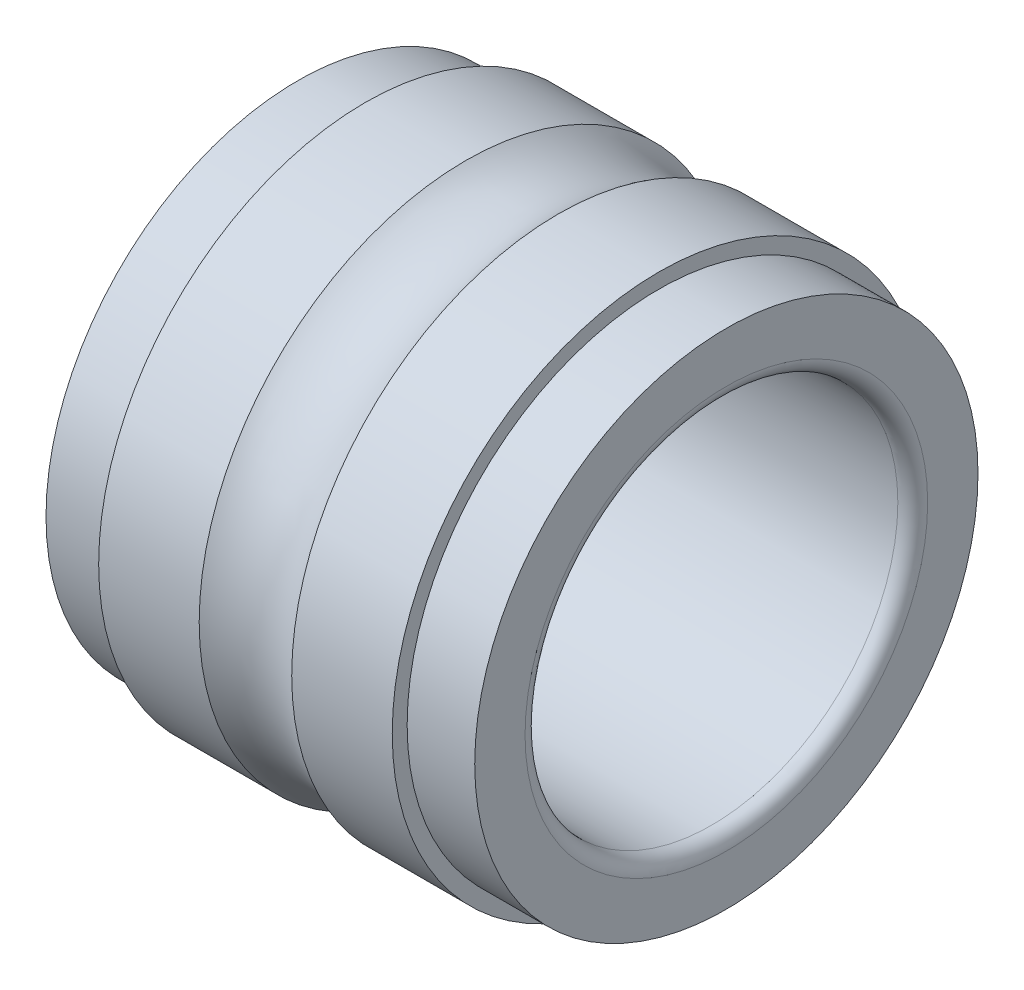
ISO-10303-21;
HEADER;
FILE_DESCRIPTION(('STEP AP214'),'2;1');
FILE_NAME('part.step','',(''),(''),'','','');
FILE_SCHEMA(('AUTOMOTIVE_DESIGN { 1 0 10303 214 1 1 1 1 }'));
ENDSEC;
DATA;
#1=APPLICATION_CONTEXT('core data for automotive mechanical design processes');
#2=APPLICATION_PROTOCOL_DEFINITION('international standard','automotive_design',2000,#1);
#3=PRODUCT_CONTEXT('',#1,'mechanical');
#4=PRODUCT('Part','Part','',(#3));
#5=PRODUCT_RELATED_PRODUCT_CATEGORY('part','',(#4));
#6=PRODUCT_DEFINITION_FORMATION('','',#4);
#7=PRODUCT_DEFINITION_CONTEXT('part definition',#1,'design');
#8=PRODUCT_DEFINITION('design','',#6,#7);
#9=PRODUCT_DEFINITION_SHAPE('','',#8);
#10=(LENGTH_UNIT() NAMED_UNIT(*) SI_UNIT(.MILLI.,.METRE.));
#11=(NAMED_UNIT(*) PLANE_ANGLE_UNIT() SI_UNIT($,.RADIAN.));
#12=(NAMED_UNIT(*) SI_UNIT($,.STERADIAN.) SOLID_ANGLE_UNIT());
#13=UNCERTAINTY_MEASURE_WITH_UNIT(LENGTH_MEASURE(1.E-05),#10,'distance_accuracy_value','');
#14=(GEOMETRIC_REPRESENTATION_CONTEXT(3) GLOBAL_UNCERTAINTY_ASSIGNED_CONTEXT((#13)) GLOBAL_UNIT_ASSIGNED_CONTEXT((#10,
#11,#12)) REPRESENTATION_CONTEXT('',''));
#15=CARTESIAN_POINT('',(0.,0.,0.));
#16=DIRECTION('',(0.,0.,1.));
#17=DIRECTION('',(1.,0.,0.));
#18=AXIS2_PLACEMENT_3D('',#15,#16,#17);
#19=CARTESIAN_POINT('',(-2.65,0.,0.));
#20=DIRECTION('',(1.,0.,0.));
#21=DIRECTION('',(0.,0.,1.));
#22=AXIS2_PLACEMENT_3D('',#19,#20,#21);
#23=TOROIDAL_SURFACE('',#22,1.775,0.425);
#24=CARTESIAN_POINT('',(-2.4018065271,0.,0.));
#25=DIRECTION('',(1.,0.,0.));
#26=DIRECTION('',(0.,0.,-1.));
#27=AXIS2_PLACEMENT_3D('',#24,#25,#26);
#28=CIRCLE('',#27,1.43);
#29=CARTESIAN_POINT('',(-2.4018065271,0.,-1.43));
#30=VERTEX_POINT('',#29);
#31=EDGE_CURVE('E166',#30,#30,#28,.T.);
#32=ORIENTED_EDGE('',*,*,#31,.F.);
#33=EDGE_LOOP('',(#32));
#34=FACE_BOUND('',#33,.T.);
#35=CARTESIAN_POINT('',(-2.89819347292004,0.,0.));
#36=DIRECTION('',(1.,0.,0.));
#37=DIRECTION('',(0.,0.,-1.));
#38=AXIS2_PLACEMENT_3D('',#35,#36,#37);
#39=CIRCLE('',#38,1.43000000000008);
#40=CARTESIAN_POINT('',(-2.89819347292004,0.,-1.43000000000008));
#41=VERTEX_POINT('',#40);
#42=EDGE_CURVE('E163',#41,#41,#39,.F.);
#43=ORIENTED_EDGE('',*,*,#42,.F.);
#44=EDGE_LOOP('',(#43));
#45=FACE_BOUND('',#44,.T.);
#46=ADVANCED_FACE('F17',(#34,#45),#23,.F.);
#47=CARTESIAN_POINT('',(-2.13215326355,0.,0.));
#48=DIRECTION('',(1.,0.,0.));
#49=DIRECTION('',(0.,0.,-1.));
#50=AXIS2_PLACEMENT_3D('',#47,#48,#49);
#51=CYLINDRICAL_SURFACE('',#50,1.43);
#52=CARTESIAN_POINT('',(-1.8625,0.,0.));
#53=DIRECTION('',(1.,0.,0.));
#54=DIRECTION('',(0.,0.,-1.));
#55=AXIS2_PLACEMENT_3D('',#52,#53,#54);
#56=CIRCLE('',#55,1.43);
#57=CARTESIAN_POINT('',(-1.8625,0.,-1.43));
#58=VERTEX_POINT('',#57);
#59=EDGE_CURVE('E165',#58,#58,#56,.T.);
#60=ORIENTED_EDGE('',*,*,#59,.F.);
#61=EDGE_LOOP('',(#60));
#62=FACE_BOUND('',#61,.T.);
#63=ORIENTED_EDGE('',*,*,#31,.T.);
#64=EDGE_LOOP('',(#63));
#65=FACE_BOUND('',#64,.T.);
#66=ADVANCED_FACE('F97',(#62,#65),#51,.T.);
#67=CARTESIAN_POINT('',(-3.16784673646002,0.,0.));
#68=DIRECTION('',(1.,0.,0.));
#69=DIRECTION('',(0.,0.,-1.));
#70=AXIS2_PLACEMENT_3D('',#67,#68,#69);
#71=CYLINDRICAL_SURFACE('',#70,1.43000000000008);
#72=ORIENTED_EDGE('',*,*,#42,.T.);
#73=EDGE_LOOP('',(#72));
#74=FACE_BOUND('',#73,.T.);
#75=CARTESIAN_POINT('',(-3.4375,0.,0.));
#76=DIRECTION('',(1.,0.,0.));
#77=DIRECTION('',(0.,0.,-1.));
#78=AXIS2_PLACEMENT_3D('',#75,#76,#77);
#79=CIRCLE('',#78,1.43000000000008);
#80=CARTESIAN_POINT('',(-3.4375,0.,-1.43000000000008));
#81=VERTEX_POINT('',#80);
#82=EDGE_CURVE('E183',#81,#81,#79,.F.);
#83=ORIENTED_EDGE('',*,*,#82,.F.);
#84=EDGE_LOOP('',(#83));
#85=FACE_BOUND('',#84,.T.);
#86=ADVANCED_FACE('F94',(#74,#85),#71,.T.);
#87=CARTESIAN_POINT('',(-1.8625,0.,-1.39));
#88=DIRECTION('',(1.,0.,0.));
#89=DIRECTION('',(0.,0.,-1.));
#90=AXIS2_PLACEMENT_3D('',#87,#88,#89);
#91=PLANE('',#90);
#92=ORIENTED_EDGE('',*,*,#59,.T.);
#93=EDGE_LOOP('',(#92));
#94=FACE_BOUND('',#93,.T.);
#95=CARTESIAN_POINT('',(-1.8625,0.,0.));
#96=DIRECTION('',(1.,0.,0.));
#97=DIRECTION('',(0.,0.,-1.));
#98=AXIS2_PLACEMENT_3D('',#95,#96,#97);
#99=CIRCLE('',#98,1.35);
#100=CARTESIAN_POINT('',(-1.8625,0.,-1.35));
#101=VERTEX_POINT('',#100);
#102=EDGE_CURVE('E180',#101,#101,#99,.T.);
#103=ORIENTED_EDGE('',*,*,#102,.F.);
#104=EDGE_LOOP('',(#103));
#105=FACE_BOUND('',#104,.T.);
#106=ADVANCED_FACE('F90',(#94,#105),#91,.T.);
#107=CARTESIAN_POINT('',(-3.4375,0.,-1.39));
#108=DIRECTION('',(-1.,0.,0.));
#109=DIRECTION('',(0.,0.,1.));
#110=AXIS2_PLACEMENT_3D('',#107,#108,#109);
#111=PLANE('',#110);
#112=CARTESIAN_POINT('',(-3.4375,0.,0.));
#113=DIRECTION('',(1.,0.,0.));
#114=DIRECTION('',(0.,0.,-1.));
#115=AXIS2_PLACEMENT_3D('',#112,#113,#114);
#116=CIRCLE('',#115,1.35);
#117=CARTESIAN_POINT('',(-3.4375,0.,-1.35));
#118=VERTEX_POINT('',#117);
#119=EDGE_CURVE('E177',#118,#118,#116,.F.);
#120=ORIENTED_EDGE('',*,*,#119,.F.);
#121=EDGE_LOOP('',(#120));
#122=FACE_BOUND('',#121,.T.);
#123=ORIENTED_EDGE('',*,*,#82,.T.);
#124=EDGE_LOOP('',(#123));
#125=FACE_BOUND('',#124,.T.);
#126=ADVANCED_FACE('F86',(#122,#125),#111,.T.);
#127=CARTESIAN_POINT('',(-1.68125,0.,0.));
#128=DIRECTION('',(1.,0.,0.));
#129=DIRECTION('',(0.,0.,-1.));
#130=AXIS2_PLACEMENT_3D('',#127,#128,#129);
#131=CYLINDRICAL_SURFACE('',#130,1.35);
#132=CARTESIAN_POINT('',(-1.5,0.,0.));
#133=DIRECTION('',(1.,0.,0.));
#134=DIRECTION('',(0.,0.,-1.));
#135=AXIS2_PLACEMENT_3D('',#132,#133,#134);
#136=CIRCLE('',#135,1.35);
#137=CARTESIAN_POINT('',(-1.5,0.,-1.35));
#138=VERTEX_POINT('',#137);
#139=EDGE_CURVE('E174',#138,#138,#136,.T.);
#140=ORIENTED_EDGE('',*,*,#139,.F.);
#141=EDGE_LOOP('',(#140));
#142=FACE_BOUND('',#141,.T.);
#143=ORIENTED_EDGE('',*,*,#102,.T.);
#144=EDGE_LOOP('',(#143));
#145=FACE_BOUND('',#144,.T.);
#146=ADVANCED_FACE('F82',(#142,#145),#131,.T.);
#147=CARTESIAN_POINT('',(-3.61875,0.,0.));
#148=DIRECTION('',(1.,0.,0.));
#149=DIRECTION('',(0.,0.,-1.));
#150=AXIS2_PLACEMENT_3D('',#147,#148,#149);
#151=CYLINDRICAL_SURFACE('',#150,1.35);
#152=ORIENTED_EDGE('',*,*,#119,.T.);
#153=EDGE_LOOP('',(#152));
#154=FACE_BOUND('',#153,.T.);
#155=CARTESIAN_POINT('',(-3.8,0.,0.));
#156=DIRECTION('',(1.,0.,0.));
#157=DIRECTION('',(0.,0.,-1.));
#158=AXIS2_PLACEMENT_3D('',#155,#156,#157);
#159=CIRCLE('',#158,1.35);
#160=CARTESIAN_POINT('',(-3.8,0.,-1.35));
#161=VERTEX_POINT('',#160);
#162=EDGE_CURVE('E171',#161,#161,#159,.F.);
#163=ORIENTED_EDGE('',*,*,#162,.F.);
#164=EDGE_LOOP('',(#163));
#165=FACE_BOUND('',#164,.T.);
#166=ADVANCED_FACE('F76',(#154,#165),#151,.T.);
#167=CARTESIAN_POINT('',(-1.5,0.,-1.215));
#168=DIRECTION('',(1.,0.,0.));
#169=DIRECTION('',(0.,0.,-1.));
#170=AXIS2_PLACEMENT_3D('',#167,#168,#169);
#171=PLANE('',#170);
#172=ORIENTED_EDGE('',*,*,#139,.T.);
#173=EDGE_LOOP('',(#172));
#174=FACE_BOUND('',#173,.T.);
#175=CARTESIAN_POINT('',(-1.5,0.,0.));
#176=DIRECTION('',(1.,0.,0.));
#177=DIRECTION('',(0.,0.,-1.));
#178=AXIS2_PLACEMENT_3D('',#175,#176,#177);
#179=CIRCLE('',#178,1.08);
#180=CARTESIAN_POINT('',(-1.5,0.,-1.08));
#181=VERTEX_POINT('',#180);
#182=CARTESIAN_POINT('',(-1.5,0.,1.08));
#183=VERTEX_POINT('',#182);
#184=EDGE_CURVE('E46',#181,#183,#179,.T.);
#185=ORIENTED_EDGE('',*,*,#184,.F.);
#186=CARTESIAN_POINT('',(-1.5,0.,0.));
#187=DIRECTION('',(1.,0.,0.));
#188=DIRECTION('',(0.,0.,1.));
#189=AXIS2_PLACEMENT_3D('',#186,#187,#188);
#190=CIRCLE('',#189,1.08);
#191=EDGE_CURVE('E50',#183,#181,#190,.T.);
#192=ORIENTED_EDGE('',*,*,#191,.F.);
#193=EDGE_LOOP('',(#185,#192));
#194=FACE_BOUND('',#193,.T.);
#195=ADVANCED_FACE('F56',(#174,#194),#171,.T.);
#196=CARTESIAN_POINT('',(-3.8,0.,-1.215));
#197=DIRECTION('',(-1.,0.,0.));
#198=DIRECTION('',(0.,0.,1.));
#199=AXIS2_PLACEMENT_3D('',#196,#197,#198);
#200=PLANE('',#199);
#201=CARTESIAN_POINT('',(-3.8,0.,0.));
#202=DIRECTION('',(-1.,0.,0.));
#203=DIRECTION('',(0.,0.,1.));
#204=AXIS2_PLACEMENT_3D('',#201,#202,#203);
#205=CIRCLE('',#204,1.08);
#206=CARTESIAN_POINT('',(-3.8,0.,1.08));
#207=VERTEX_POINT('',#206);
#208=CARTESIAN_POINT('',(-3.8,0.,-1.08));
#209=VERTEX_POINT('',#208);
#210=EDGE_CURVE('E35',#207,#209,#205,.T.);
#211=ORIENTED_EDGE('',*,*,#210,.F.);
#212=CARTESIAN_POINT('',(-3.8,0.,0.));
#213=DIRECTION('',(-1.,0.,0.));
#214=DIRECTION('',(0.,0.,-1.));
#215=AXIS2_PLACEMENT_3D('',#212,#213,#214);
#216=CIRCLE('',#215,1.08);
#217=EDGE_CURVE('E57',#209,#207,#216,.T.);
#218=ORIENTED_EDGE('',*,*,#217,.F.);
#219=EDGE_LOOP('',(#211,#218));
#220=FACE_BOUND('',#219,.T.);
#221=ORIENTED_EDGE('',*,*,#162,.T.);
#222=EDGE_LOOP('',(#221));
#223=FACE_BOUND('',#222,.T.);
#224=ADVANCED_FACE('F75',(#220,#223),#200,.T.);
#225=CARTESIAN_POINT('',(-1.58,0.,0.));
#226=DIRECTION('',(1.,0.,0.));
#227=DIRECTION('',(0.,0.,1.));
#228=AXIS2_PLACEMENT_3D('',#225,#226,#227);
#229=TOROIDAL_SURFACE('',#228,1.08,0.080000000000001);
#230=ORIENTED_EDGE('',*,*,#184,.T.);
#231=ORIENTED_EDGE('',*,*,#191,.T.);
#232=EDGE_LOOP('',(#230,#231));
#233=FACE_BOUND('',#232,.T.);
#234=CARTESIAN_POINT('',(-1.58,0.,0.));
#235=DIRECTION('',(1.,0.,0.));
#236=DIRECTION('',(0.,0.,-1.));
#237=AXIS2_PLACEMENT_3D('',#234,#235,#236);
#238=CIRCLE('',#237,1.);
#239=CARTESIAN_POINT('',(-1.58,0.,-1.));
#240=VERTEX_POINT('',#239);
#241=EDGE_CURVE('E29',#240,#240,#238,.F.);
#242=ORIENTED_EDGE('',*,*,#241,.T.);
#243=EDGE_LOOP('',(#242));
#244=FACE_BOUND('',#243,.T.);
#245=ADVANCED_FACE('F48',(#233,#244),#229,.T.);
#246=CARTESIAN_POINT('',(-3.72,0.,0.));
#247=DIRECTION('',(1.,0.,0.));
#248=DIRECTION('',(0.,0.,1.));
#249=AXIS2_PLACEMENT_3D('',#246,#247,#248);
#250=TOROIDAL_SURFACE('',#249,1.08,0.08);
#251=CARTESIAN_POINT('',(-3.72,0.,0.));
#252=DIRECTION('',(1.,0.,0.));
#253=DIRECTION('',(0.,0.,-1.));
#254=AXIS2_PLACEMENT_3D('',#251,#252,#253);
#255=CIRCLE('',#254,1.);
#256=CARTESIAN_POINT('',(-3.72,0.,-1.));
#257=VERTEX_POINT('',#256);
#258=EDGE_CURVE('E11',#257,#257,#255,.T.);
#259=ORIENTED_EDGE('',*,*,#258,.T.);
#260=EDGE_LOOP('',(#259));
#261=FACE_BOUND('',#260,.T.);
#262=ORIENTED_EDGE('',*,*,#217,.T.);
#263=ORIENTED_EDGE('',*,*,#210,.T.);
#264=EDGE_LOOP('',(#262,#263));
#265=FACE_BOUND('',#264,.T.);
#266=ADVANCED_FACE('F110',(#261,#265),#250,.T.);
#267=CARTESIAN_POINT('',(-2.65,0.,0.));
#268=DIRECTION('',(1.,0.,0.));
#269=DIRECTION('',(0.,0.,-1.));
#270=AXIS2_PLACEMENT_3D('',#267,#268,#269);
#271=CYLINDRICAL_SURFACE('',#270,1.);
#272=ORIENTED_EDGE('',*,*,#258,.F.);
#273=EDGE_LOOP('',(#272));
#274=FACE_BOUND('',#273,.T.);
#275=ORIENTED_EDGE('',*,*,#241,.F.);
#276=EDGE_LOOP('',(#275));
#277=FACE_BOUND('',#276,.T.);
#278=ADVANCED_FACE('F108',(#274,#277),#271,.F.);
#279=CLOSED_SHELL('',(#46,#66,#86,#106,#126,#146,#166,#195,#224,#245,#266,#278));
#280=MANIFOLD_SOLID_BREP('B1',#279);
#281=ADVANCED_BREP_SHAPE_REPRESENTATION('',(#18,#280),#14);
#282=SHAPE_DEFINITION_REPRESENTATION(#9,#281);
ENDSEC;
END-ISO-10303-21;
